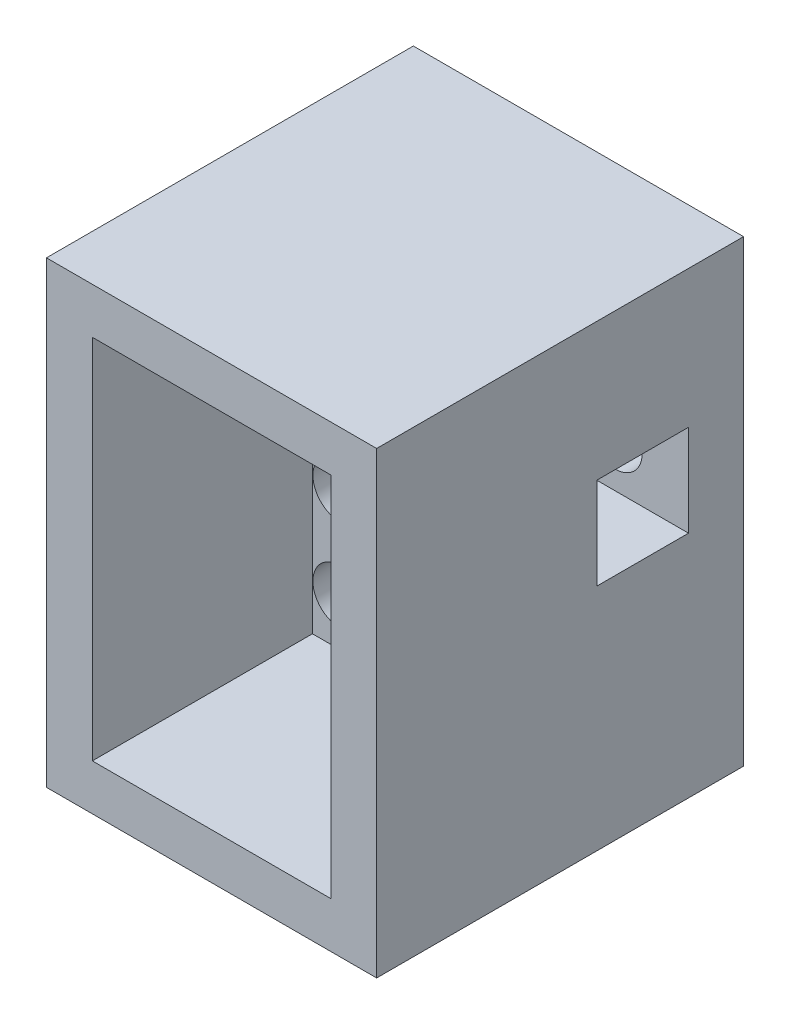
ISO-10303-21;
HEADER;
FILE_DESCRIPTION(('STEP AP214'),'2;1');
FILE_NAME('part.step','',(''),(''),'','','');
FILE_SCHEMA(('AUTOMOTIVE_DESIGN { 1 0 10303 214 1 1 1 1 }'));
ENDSEC;
DATA;
#1=APPLICATION_CONTEXT('core data for automotive mechanical design processes');
#2=APPLICATION_PROTOCOL_DEFINITION('international standard','automotive_design',2000,#1);
#3=PRODUCT_CONTEXT('',#1,'mechanical');
#4=PRODUCT('Part','Part','',(#3));
#5=PRODUCT_RELATED_PRODUCT_CATEGORY('part','',(#4));
#6=PRODUCT_DEFINITION_FORMATION('','',#4);
#7=PRODUCT_DEFINITION_CONTEXT('part definition',#1,'design');
#8=PRODUCT_DEFINITION('design','',#6,#7);
#9=PRODUCT_DEFINITION_SHAPE('','',#8);
#10=(LENGTH_UNIT() NAMED_UNIT(*) SI_UNIT(.MILLI.,.METRE.));
#11=(NAMED_UNIT(*) PLANE_ANGLE_UNIT() SI_UNIT($,.RADIAN.));
#12=(NAMED_UNIT(*) SI_UNIT($,.STERADIAN.) SOLID_ANGLE_UNIT());
#13=UNCERTAINTY_MEASURE_WITH_UNIT(LENGTH_MEASURE(1.E-05),#10,'distance_accuracy_value','');
#14=(GEOMETRIC_REPRESENTATION_CONTEXT(3) GLOBAL_UNCERTAINTY_ASSIGNED_CONTEXT((#13)) GLOBAL_UNIT_ASSIGNED_CONTEXT((#10,
#11,#12)) REPRESENTATION_CONTEXT('',''));
#15=CARTESIAN_POINT('',(0.,0.,0.));
#16=DIRECTION('',(0.,0.,1.));
#17=DIRECTION('',(1.,0.,0.));
#18=AXIS2_PLACEMENT_3D('',#15,#16,#17);
#19=CARTESIAN_POINT('',(0.,0.,8.));
#20=DIRECTION('',(0.,0.,1.));
#21=DIRECTION('',(1.,0.,0.));
#22=AXIS2_PLACEMENT_3D('',#19,#20,#21);
#23=PLANE('',#22);
#24=CARTESIAN_POINT('',(5.,7.5,8.));
#25=DIRECTION('',(0.,0.,1.));
#26=DIRECTION('',(1.,0.,0.));
#27=AXIS2_PLACEMENT_3D('',#24,#25,#26);
#28=CIRCLE('',#27,1.475);
#29=CARTESIAN_POINT('',(6.475,7.5,8.));
#30=VERTEX_POINT('',#29);
#31=EDGE_CURVE('E350',#30,#30,#28,.T.);
#32=ORIENTED_EDGE('',*,*,#31,.F.);
#33=EDGE_LOOP('',(#32));
#34=FACE_BOUND('',#33,.T.);
#35=DIRECTION('',(0.,1.,0.));
#36=VECTOR('',#35,1.);
#37=CARTESIAN_POINT('',(2.5,10.,8.));
#38=LINE('',#37,#36);
#39=CARTESIAN_POINT('',(2.5,7.00000000000001,8.));
#40=VERTEX_POINT('',#39);
#41=CARTESIAN_POINT('',(2.5,10.,8.));
#42=VERTEX_POINT('',#41);
#43=EDGE_CURVE('E217',#40,#42,#38,.T.);
#44=ORIENTED_EDGE('',*,*,#43,.F.);
#45=DIRECTION('',(-0.707106781186547,0.707106781186548,0.));
#46=VECTOR('',#45,1.);
#47=CARTESIAN_POINT('',(4.75,4.75,8.));
#48=LINE('',#47,#46);
#49=CARTESIAN_POINT('',(4.5,5.,8.));
#50=VERTEX_POINT('',#49);
#51=EDGE_CURVE('E55',#40,#50,#48,.F.);
#52=ORIENTED_EDGE('',*,*,#51,.T.);
#53=DIRECTION('',(1.,0.,0.));
#54=VECTOR('',#53,1.);
#55=CARTESIAN_POINT('',(-4.57106781186548,5.,8.));
#56=LINE('',#55,#54);
#57=CARTESIAN_POINT('',(6.5,5.,8.));
#58=VERTEX_POINT('',#57);
#59=EDGE_CURVE('E198',#50,#58,#56,.T.);
#60=ORIENTED_EDGE('',*,*,#59,.T.);
#61=DIRECTION('',(0.,1.,0.));
#62=VECTOR('',#61,1.);
#63=CARTESIAN_POINT('',(6.5,10.,8.));
#64=LINE('',#63,#62);
#65=CARTESIAN_POINT('',(6.5,10.,8.));
#66=VERTEX_POINT('',#65);
#67=EDGE_CURVE('E250',#58,#66,#64,.T.);
#68=ORIENTED_EDGE('',*,*,#67,.T.);
#69=DIRECTION('',(-1.,0.,0.));
#70=VECTOR('',#69,1.);
#71=CARTESIAN_POINT('',(-6.5,10.,8.));
#72=LINE('',#71,#70);
#73=EDGE_CURVE('E246',#66,#42,#72,.T.);
#74=ORIENTED_EDGE('',*,*,#73,.T.);
#75=EDGE_LOOP('',(#44,#52,#60,#68,#74));
#76=FACE_BOUND('',#75,.T.);
#77=ADVANCED_FACE('F43',(#34,#76),#23,.T.);
#78=CARTESIAN_POINT('',(2.5,10.,0.));
#79=DIRECTION('',(1.,0.,0.));
#80=DIRECTION('',(0.,1.,0.));
#81=AXIS2_PLACEMENT_3D('',#78,#79,#80);
#82=PLANE('',#81);
#83=DIRECTION('',(0.,-1.,0.));
#84=VECTOR('',#83,1.);
#85=CARTESIAN_POINT('',(2.5,0.,3.));
#86=LINE('',#85,#84);
#87=CARTESIAN_POINT('',(2.5,7.00000000000001,3.));
#88=VERTEX_POINT('',#87);
#89=CARTESIAN_POINT('',(2.5,0.,3.));
#90=VERTEX_POINT('',#89);
#91=EDGE_CURVE('E56',#88,#90,#86,.T.);
#92=ORIENTED_EDGE('',*,*,#91,.F.);
#93=DIRECTION('',(0.,0.,1.));
#94=VECTOR('',#93,1.);
#95=CARTESIAN_POINT('',(2.5,7.00000000000001,0.));
#96=LINE('',#95,#94);
#97=EDGE_CURVE('E61',#88,#40,#96,.T.);
#98=ORIENTED_EDGE('',*,*,#97,.T.);
#99=ORIENTED_EDGE('',*,*,#43,.T.);
#100=DIRECTION('',(0.,0.,1.));
#101=VECTOR('',#100,1.);
#102=CARTESIAN_POINT('',(2.5,10.,0.));
#103=LINE('',#102,#101);
#104=CARTESIAN_POINT('',(2.5,10.,0.));
#105=VERTEX_POINT('',#104);
#106=EDGE_CURVE('E240',#105,#42,#103,.T.);
#107=ORIENTED_EDGE('',*,*,#106,.F.);
#108=DIRECTION('',(0.,1.,0.));
#109=VECTOR('',#108,1.);
#110=CARTESIAN_POINT('',(2.5,10.,0.));
#111=LINE('',#110,#109);
#112=CARTESIAN_POINT('',(2.5,0.,0.));
#113=VERTEX_POINT('',#112);
#114=EDGE_CURVE('E222',#113,#105,#111,.T.);
#115=ORIENTED_EDGE('',*,*,#114,.F.);
#116=DIRECTION('',(0.,0.,1.));
#117=VECTOR('',#116,1.);
#118=CARTESIAN_POINT('',(2.5,0.,0.));
#119=LINE('',#118,#117);
#120=EDGE_CURVE('E238',#113,#90,#119,.T.);
#121=ORIENTED_EDGE('',*,*,#120,.T.);
#122=EDGE_LOOP('',(#92,#98,#99,#107,#115,#121));
#123=FACE_BOUND('',#122,.T.);
#124=ADVANCED_FACE('F361',(#123),#82,.F.);
#125=CARTESIAN_POINT('',(5.,7.5,10.));
#126=DIRECTION('',(0.,0.,-1.));
#127=DIRECTION('',(-1.,0.,0.));
#128=AXIS2_PLACEMENT_3D('',#125,#126,#127);
#129=CYLINDRICAL_SURFACE('',#128,1.475);
#130=ORIENTED_EDGE('',*,*,#31,.T.);
#131=EDGE_LOOP('',(#130));
#132=FACE_BOUND('',#131,.T.);
#133=CARTESIAN_POINT('',(5.,7.5,0.));
#134=DIRECTION('',(0.,0.,-1.));
#135=DIRECTION('',(-1.,0.,0.));
#136=AXIS2_PLACEMENT_3D('',#133,#134,#135);
#137=CIRCLE('',#136,1.475);
#138=CARTESIAN_POINT('',(3.525,7.5,0.));
#139=VERTEX_POINT('',#138);
#140=EDGE_CURVE('E348',#139,#139,#137,.T.);
#141=ORIENTED_EDGE('',*,*,#140,.T.);
#142=EDGE_LOOP('',(#141));
#143=FACE_BOUND('',#142,.T.);
#144=ADVANCED_FACE('F418',(#132,#143),#129,.F.);
#145=CARTESIAN_POINT('',(-5.,7.5,10.));
#146=DIRECTION('',(0.,0.,-1.));
#147=DIRECTION('',(-1.,0.,0.));
#148=AXIS2_PLACEMENT_3D('',#145,#146,#147);
#149=CYLINDRICAL_SURFACE('',#148,1.475);
#150=CARTESIAN_POINT('',(-5.,7.5,8.));
#151=DIRECTION('',(0.,0.,1.));
#152=DIRECTION('',(1.,0.,0.));
#153=AXIS2_PLACEMENT_3D('',#150,#151,#152);
#154=CIRCLE('',#153,1.475);
#155=CARTESIAN_POINT('',(-3.525,7.5,8.));
#156=VERTEX_POINT('',#155);
#157=EDGE_CURVE('E343',#156,#156,#154,.T.);
#158=ORIENTED_EDGE('',*,*,#157,.T.);
#159=EDGE_LOOP('',(#158));
#160=FACE_BOUND('',#159,.T.);
#161=CARTESIAN_POINT('',(-5.,7.5,0.));
#162=DIRECTION('',(0.,0.,-1.));
#163=DIRECTION('',(-1.,0.,0.));
#164=AXIS2_PLACEMENT_3D('',#161,#162,#163);
#165=CIRCLE('',#164,1.475);
#166=CARTESIAN_POINT('',(-6.475,7.5,0.));
#167=VERTEX_POINT('',#166);
#168=EDGE_CURVE('E342',#167,#167,#165,.T.);
#169=ORIENTED_EDGE('',*,*,#168,.T.);
#170=EDGE_LOOP('',(#169));
#171=FACE_BOUND('',#170,.T.);
#172=ADVANCED_FACE('F532',(#160,#171),#149,.F.);
#173=CARTESIAN_POINT('',(5.,2.5,10.));
#174=DIRECTION('',(0.,0.,-1.));
#175=DIRECTION('',(-1.,0.,0.));
#176=AXIS2_PLACEMENT_3D('',#173,#174,#175);
#177=CYLINDRICAL_SURFACE('',#176,1.475);
#178=CARTESIAN_POINT('',(5.,2.5,3.));
#179=DIRECTION('',(0.,0.,-1.));
#180=DIRECTION('',(-1.,0.,0.));
#181=AXIS2_PLACEMENT_3D('',#178,#179,#180);
#182=CIRCLE('',#181,1.475);
#183=CARTESIAN_POINT('',(3.525,2.5,3.));
#184=VERTEX_POINT('',#183);
#185=EDGE_CURVE('E199',#184,#184,#182,.F.);
#186=ORIENTED_EDGE('',*,*,#185,.T.);
#187=EDGE_LOOP('',(#186));
#188=FACE_BOUND('',#187,.T.);
#189=CARTESIAN_POINT('',(5.,2.5,0.));
#190=DIRECTION('',(0.,0.,-1.));
#191=DIRECTION('',(-1.,0.,0.));
#192=AXIS2_PLACEMENT_3D('',#189,#190,#191);
#193=CIRCLE('',#192,1.475);
#194=CARTESIAN_POINT('',(3.525,2.5,0.));
#195=VERTEX_POINT('',#194);
#196=EDGE_CURVE('E336',#195,#195,#193,.T.);
#197=ORIENTED_EDGE('',*,*,#196,.T.);
#198=EDGE_LOOP('',(#197));
#199=FACE_BOUND('',#198,.T.);
#200=ADVANCED_FACE('F524',(#188,#199),#177,.F.);
#201=CARTESIAN_POINT('',(-5.,2.5,10.));
#202=DIRECTION('',(0.,0.,-1.));
#203=DIRECTION('',(-1.,0.,0.));
#204=AXIS2_PLACEMENT_3D('',#201,#202,#203);
#205=CYLINDRICAL_SURFACE('',#204,1.475);
#206=CARTESIAN_POINT('',(-5.,2.5,8.));
#207=DIRECTION('',(0.,0.,1.));
#208=DIRECTION('',(1.,0.,0.));
#209=AXIS2_PLACEMENT_3D('',#206,#207,#208);
#210=CIRCLE('',#209,1.475);
#211=CARTESIAN_POINT('',(-3.525,2.5,8.));
#212=VERTEX_POINT('',#211);
#213=EDGE_CURVE('E335',#212,#212,#210,.T.);
#214=ORIENTED_EDGE('',*,*,#213,.T.);
#215=EDGE_LOOP('',(#214));
#216=FACE_BOUND('',#215,.T.);
#217=CARTESIAN_POINT('',(-5.,2.5,0.));
#218=DIRECTION('',(0.,0.,-1.));
#219=DIRECTION('',(-1.,0.,0.));
#220=AXIS2_PLACEMENT_3D('',#217,#218,#219);
#221=CIRCLE('',#220,1.475);
#222=CARTESIAN_POINT('',(-6.475,2.5,0.));
#223=VERTEX_POINT('',#222);
#224=EDGE_CURVE('E333',#223,#223,#221,.T.);
#225=ORIENTED_EDGE('',*,*,#224,.T.);
#226=EDGE_LOOP('',(#225));
#227=FACE_BOUND('',#226,.T.);
#228=ADVANCED_FACE('F513',(#216,#227),#205,.F.);
#229=CARTESIAN_POINT('',(5.,-2.5,10.));
#230=DIRECTION('',(0.,0.,-1.));
#231=DIRECTION('',(-1.,0.,0.));
#232=AXIS2_PLACEMENT_3D('',#229,#230,#231);
#233=CYLINDRICAL_SURFACE('',#232,1.475);
#234=CARTESIAN_POINT('',(5.,-2.5,8.));
#235=DIRECTION('',(0.,0.,1.));
#236=DIRECTION('',(1.,0.,0.));
#237=AXIS2_PLACEMENT_3D('',#234,#235,#236);
#238=CIRCLE('',#237,1.475);
#239=CARTESIAN_POINT('',(6.475,-2.5,8.));
#240=VERTEX_POINT('',#239);
#241=EDGE_CURVE('E326',#240,#240,#238,.T.);
#242=ORIENTED_EDGE('',*,*,#241,.T.);
#243=EDGE_LOOP('',(#242));
#244=FACE_BOUND('',#243,.T.);
#245=CARTESIAN_POINT('',(5.,-2.5,0.));
#246=DIRECTION('',(0.,0.,-1.));
#247=DIRECTION('',(-1.,0.,0.));
#248=AXIS2_PLACEMENT_3D('',#245,#246,#247);
#249=CIRCLE('',#248,1.475);
#250=CARTESIAN_POINT('',(3.525,-2.5,0.));
#251=VERTEX_POINT('',#250);
#252=EDGE_CURVE('E328',#251,#251,#249,.T.);
#253=ORIENTED_EDGE('',*,*,#252,.T.);
#254=EDGE_LOOP('',(#253));
#255=FACE_BOUND('',#254,.T.);
#256=ADVANCED_FACE('F504',(#244,#255),#233,.F.);
#257=CARTESIAN_POINT('',(-5.,-2.5,10.));
#258=DIRECTION('',(0.,0.,-1.));
#259=DIRECTION('',(-1.,0.,0.));
#260=AXIS2_PLACEMENT_3D('',#257,#258,#259);
#261=CYLINDRICAL_SURFACE('',#260,1.475);
#262=CARTESIAN_POINT('',(-5.,-2.5,8.));
#263=DIRECTION('',(0.,0.,1.));
#264=DIRECTION('',(1.,0.,0.));
#265=AXIS2_PLACEMENT_3D('',#262,#263,#264);
#266=CIRCLE('',#265,1.475);
#267=CARTESIAN_POINT('',(-3.525,-2.5,8.));
#268=VERTEX_POINT('',#267);
#269=EDGE_CURVE('E319',#268,#268,#266,.T.);
#270=ORIENTED_EDGE('',*,*,#269,.T.);
#271=EDGE_LOOP('',(#270));
#272=FACE_BOUND('',#271,.T.);
#273=CARTESIAN_POINT('',(-5.,-2.5,0.));
#274=DIRECTION('',(0.,0.,-1.));
#275=DIRECTION('',(-1.,0.,0.));
#276=AXIS2_PLACEMENT_3D('',#273,#274,#275);
#277=CIRCLE('',#276,1.475);
#278=CARTESIAN_POINT('',(-6.475,-2.5,0.));
#279=VERTEX_POINT('',#278);
#280=EDGE_CURVE('E323',#279,#279,#277,.T.);
#281=ORIENTED_EDGE('',*,*,#280,.T.);
#282=EDGE_LOOP('',(#281));
#283=FACE_BOUND('',#282,.T.);
#284=ADVANCED_FACE('F494',(#272,#283),#261,.F.);
#285=CARTESIAN_POINT('',(5.,-7.5,10.));
#286=DIRECTION('',(0.,0.,-1.));
#287=DIRECTION('',(-1.,0.,0.));
#288=AXIS2_PLACEMENT_3D('',#285,#286,#287);
#289=CYLINDRICAL_SURFACE('',#288,1.475);
#290=CARTESIAN_POINT('',(5.,-7.5,8.));
#291=DIRECTION('',(0.,0.,1.));
#292=DIRECTION('',(1.,0.,0.));
#293=AXIS2_PLACEMENT_3D('',#290,#291,#292);
#294=CIRCLE('',#293,1.475);
#295=CARTESIAN_POINT('',(6.475,-7.5,8.));
#296=VERTEX_POINT('',#295);
#297=EDGE_CURVE('E314',#296,#296,#294,.T.);
#298=ORIENTED_EDGE('',*,*,#297,.T.);
#299=EDGE_LOOP('',(#298));
#300=FACE_BOUND('',#299,.T.);
#301=CARTESIAN_POINT('',(5.,-7.5,0.));
#302=DIRECTION('',(0.,0.,-1.));
#303=DIRECTION('',(-1.,0.,0.));
#304=AXIS2_PLACEMENT_3D('',#301,#302,#303);
#305=CIRCLE('',#304,1.475);
#306=CARTESIAN_POINT('',(3.525,-7.5,0.));
#307=VERTEX_POINT('',#306);
#308=EDGE_CURVE('E320',#307,#307,#305,.T.);
#309=ORIENTED_EDGE('',*,*,#308,.T.);
#310=EDGE_LOOP('',(#309));
#311=FACE_BOUND('',#310,.T.);
#312=ADVANCED_FACE('F484',(#300,#311),#289,.F.);
#313=CARTESIAN_POINT('',(0.,-7.5,10.));
#314=DIRECTION('',(0.,0.,-1.));
#315=DIRECTION('',(-1.,0.,0.));
#316=AXIS2_PLACEMENT_3D('',#313,#314,#315);
#317=CYLINDRICAL_SURFACE('',#316,1.475);
#318=CARTESIAN_POINT('',(0.,-7.5,8.));
#319=DIRECTION('',(0.,0.,1.));
#320=DIRECTION('',(1.,0.,0.));
#321=AXIS2_PLACEMENT_3D('',#318,#319,#320);
#322=CIRCLE('',#321,1.475);
#323=CARTESIAN_POINT('',(1.475,-7.5,8.));
#324=VERTEX_POINT('',#323);
#325=EDGE_CURVE('E308',#324,#324,#322,.T.);
#326=ORIENTED_EDGE('',*,*,#325,.T.);
#327=EDGE_LOOP('',(#326));
#328=FACE_BOUND('',#327,.T.);
#329=CARTESIAN_POINT('',(0.,-7.5,0.));
#330=DIRECTION('',(0.,0.,-1.));
#331=DIRECTION('',(-1.,0.,0.));
#332=AXIS2_PLACEMENT_3D('',#329,#330,#331);
#333=CIRCLE('',#332,1.475);
#334=CARTESIAN_POINT('',(-1.475,-7.5,0.));
#335=VERTEX_POINT('',#334);
#336=EDGE_CURVE('E313',#335,#335,#333,.T.);
#337=ORIENTED_EDGE('',*,*,#336,.T.);
#338=EDGE_LOOP('',(#337));
#339=FACE_BOUND('',#338,.T.);
#340=ADVANCED_FACE('F479',(#328,#339),#317,.F.);
#341=CARTESIAN_POINT('',(-9.,12.5,20.));
#342=DIRECTION('',(0.,-1.,0.));
#343=DIRECTION('',(0.,0.,-1.));
#344=AXIS2_PLACEMENT_3D('',#341,#342,#343);
#345=PLANE('',#344);
#346=DIRECTION('',(-1.,0.,0.));
#347=VECTOR('',#346,1.);
#348=CARTESIAN_POINT('',(-9.,12.5,0.));
#349=LINE('',#348,#347);
#350=CARTESIAN_POINT('',(9.,12.5,0.));
#351=VERTEX_POINT('',#350);
#352=CARTESIAN_POINT('',(-9.,12.5,0.));
#353=VERTEX_POINT('',#352);
#354=EDGE_CURVE('E269',#351,#353,#349,.T.);
#355=ORIENTED_EDGE('',*,*,#354,.T.);
#356=DIRECTION('',(0.,0.,-1.));
#357=VECTOR('',#356,1.);
#358=CARTESIAN_POINT('',(-9.,12.5,20.));
#359=LINE('',#358,#357);
#360=CARTESIAN_POINT('',(-9.,12.5,20.));
#361=VERTEX_POINT('',#360);
#362=EDGE_CURVE('E301',#361,#353,#359,.T.);
#363=ORIENTED_EDGE('',*,*,#362,.F.);
#364=DIRECTION('',(-1.,0.,0.));
#365=VECTOR('',#364,1.);
#366=CARTESIAN_POINT('',(-9.,12.5,20.));
#367=LINE('',#366,#365);
#368=CARTESIAN_POINT('',(9.,12.5,20.));
#369=VERTEX_POINT('',#368);
#370=EDGE_CURVE('E280',#369,#361,#367,.T.);
#371=ORIENTED_EDGE('',*,*,#370,.F.);
#372=DIRECTION('',(0.,0.,-1.));
#373=VECTOR('',#372,1.);
#374=CARTESIAN_POINT('',(9.,12.5,20.));
#375=LINE('',#374,#373);
#376=EDGE_CURVE('E290',#369,#351,#375,.T.);
#377=ORIENTED_EDGE('',*,*,#376,.T.);
#378=EDGE_LOOP('',(#355,#363,#371,#377));
#379=FACE_BOUND('',#378,.T.);
#380=ADVANCED_FACE('F482',(#379),#345,.F.);
#381=CARTESIAN_POINT('',(-9.,-12.5,20.));
#382=DIRECTION('',(1.,0.,0.));
#383=DIRECTION('',(0.,0.,-1.));
#384=AXIS2_PLACEMENT_3D('',#381,#382,#383);
#385=PLANE('',#384);
#386=DIRECTION('',(0.,-1.,0.));
#387=VECTOR('',#386,1.);
#388=CARTESIAN_POINT('',(-9.,-12.5,0.));
#389=LINE('',#388,#387);
#390=CARTESIAN_POINT('',(-9.,-12.5,0.));
#391=VERTEX_POINT('',#390);
#392=EDGE_CURVE('E289',#353,#391,#389,.T.);
#393=ORIENTED_EDGE('',*,*,#392,.T.);
#394=DIRECTION('',(0.,0.,-1.));
#395=VECTOR('',#394,1.);
#396=CARTESIAN_POINT('',(-9.,-12.5,20.));
#397=LINE('',#396,#395);
#398=CARTESIAN_POINT('',(-9.,-12.5,20.));
#399=VERTEX_POINT('',#398);
#400=EDGE_CURVE('E299',#399,#391,#397,.T.);
#401=ORIENTED_EDGE('',*,*,#400,.F.);
#402=DIRECTION('',(0.,-1.,0.));
#403=VECTOR('',#402,1.);
#404=CARTESIAN_POINT('',(-9.,-12.5,20.));
#405=LINE('',#404,#403);
#406=EDGE_CURVE('E278',#361,#399,#405,.T.);
#407=ORIENTED_EDGE('',*,*,#406,.F.);
#408=ORIENTED_EDGE('',*,*,#362,.T.);
#409=EDGE_LOOP('',(#393,#401,#407,#408));
#410=FACE_BOUND('',#409,.T.);
#411=ADVANCED_FACE('F614',(#410),#385,.F.);
#412=CARTESIAN_POINT('',(-9.,-12.5,20.));
#413=DIRECTION('',(0.,1.,0.));
#414=DIRECTION('',(-1.,0.,0.));
#415=AXIS2_PLACEMENT_3D('',#412,#413,#414);
#416=PLANE('',#415);
#417=DIRECTION('',(1.,0.,0.));
#418=VECTOR('',#417,1.);
#419=CARTESIAN_POINT('',(-9.,-12.5,0.));
#420=LINE('',#419,#418);
#421=CARTESIAN_POINT('',(9.,-12.5,0.));
#422=VERTEX_POINT('',#421);
#423=EDGE_CURVE('E295',#391,#422,#420,.T.);
#424=ORIENTED_EDGE('',*,*,#423,.T.);
#425=DIRECTION('',(0.,0.,-1.));
#426=VECTOR('',#425,1.);
#427=CARTESIAN_POINT('',(9.,-12.5,20.));
#428=LINE('',#427,#426);
#429=CARTESIAN_POINT('',(9.,-12.5,20.));
#430=VERTEX_POINT('',#429);
#431=EDGE_CURVE('E300',#430,#422,#428,.T.);
#432=ORIENTED_EDGE('',*,*,#431,.F.);
#433=DIRECTION('',(1.,0.,0.));
#434=VECTOR('',#433,1.);
#435=CARTESIAN_POINT('',(-9.,-12.5,20.));
#436=LINE('',#435,#434);
#437=EDGE_CURVE('E281',#399,#430,#436,.T.);
#438=ORIENTED_EDGE('',*,*,#437,.F.);
#439=ORIENTED_EDGE('',*,*,#400,.T.);
#440=EDGE_LOOP('',(#424,#432,#438,#439));
#441=FACE_BOUND('',#440,.T.);
#442=ADVANCED_FACE('F610',(#441),#416,.F.);
#443=CARTESIAN_POINT('',(9.,-12.5,20.));
#444=DIRECTION('',(-1.,0.,0.));
#445=DIRECTION('',(0.,0.,1.));
#446=AXIS2_PLACEMENT_3D('',#443,#444,#445);
#447=PLANE('',#446);
#448=DIRECTION('',(0.,1.,0.));
#449=VECTOR('',#448,1.);
#450=CARTESIAN_POINT('',(9.,0.,3.));
#451=LINE('',#450,#449);
#452=CARTESIAN_POINT('',(9.,0.,3.));
#453=VERTEX_POINT('',#452);
#454=CARTESIAN_POINT('',(9.,5.,3.));
#455=VERTEX_POINT('',#454);
#456=EDGE_CURVE('E176',#453,#455,#451,.T.);
#457=ORIENTED_EDGE('',*,*,#456,.F.);
#458=DIRECTION('',(0.,0.,-1.));
#459=VECTOR('',#458,1.);
#460=CARTESIAN_POINT('',(9.,0.,3.));
#461=LINE('',#460,#459);
#462=CARTESIAN_POINT('',(9.,0.,8.));
#463=VERTEX_POINT('',#462);
#464=EDGE_CURVE('E184',#463,#453,#461,.T.);
#465=ORIENTED_EDGE('',*,*,#464,.F.);
#466=DIRECTION('',(0.,-1.,0.));
#467=VECTOR('',#466,1.);
#468=CARTESIAN_POINT('',(9.,0.,8.));
#469=LINE('',#468,#467);
#470=CARTESIAN_POINT('',(9.,5.,8.));
#471=VERTEX_POINT('',#470);
#472=EDGE_CURVE('E187',#471,#463,#469,.T.);
#473=ORIENTED_EDGE('',*,*,#472,.F.);
#474=DIRECTION('',(0.,0.,1.));
#475=VECTOR('',#474,1.);
#476=CARTESIAN_POINT('',(9.,5.,3.));
#477=LINE('',#476,#475);
#478=EDGE_CURVE('E169',#455,#471,#477,.T.);
#479=ORIENTED_EDGE('',*,*,#478,.F.);
#480=EDGE_LOOP('',(#457,#465,#473,#479));
#481=FACE_BOUND('',#480,.T.);
#482=DIRECTION('',(0.,1.,0.));
#483=VECTOR('',#482,1.);
#484=CARTESIAN_POINT('',(9.,-12.5,0.));
#485=LINE('',#484,#483);
#486=EDGE_CURVE('E283',#422,#351,#485,.T.);
#487=ORIENTED_EDGE('',*,*,#486,.T.);
#488=ORIENTED_EDGE('',*,*,#376,.F.);
#489=DIRECTION('',(0.,1.,0.));
#490=VECTOR('',#489,1.);
#491=CARTESIAN_POINT('',(9.,-12.5,20.));
#492=LINE('',#491,#490);
#493=EDGE_CURVE('E284',#430,#369,#492,.T.);
#494=ORIENTED_EDGE('',*,*,#493,.F.);
#495=ORIENTED_EDGE('',*,*,#431,.T.);
#496=EDGE_LOOP('',(#487,#488,#494,#495));
#497=FACE_BOUND('',#496,.T.);
#498=ADVANCED_FACE('F188',(#481,#497),#447,.F.);
#499=CARTESIAN_POINT('',(0.,0.,20.));
#500=DIRECTION('',(0.,0.,1.));
#501=DIRECTION('',(1.,0.,0.));
#502=AXIS2_PLACEMENT_3D('',#499,#500,#501);
#503=PLANE('',#502);
#504=DIRECTION('',(0.,1.,0.));
#505=VECTOR('',#504,1.);
#506=CARTESIAN_POINT('',(6.5,10.,20.));
#507=LINE('',#506,#505);
#508=CARTESIAN_POINT('',(6.5,-10.,20.));
#509=VERTEX_POINT('',#508);
#510=CARTESIAN_POINT('',(6.5,10.,20.));
#511=VERTEX_POINT('',#510);
#512=EDGE_CURVE('E237',#509,#511,#507,.T.);
#513=ORIENTED_EDGE('',*,*,#512,.F.);
#514=DIRECTION('',(1.,0.,0.));
#515=VECTOR('',#514,1.);
#516=CARTESIAN_POINT('',(-6.5,-10.,20.));
#517=LINE('',#516,#515);
#518=CARTESIAN_POINT('',(-6.5,-10.,20.));
#519=VERTEX_POINT('',#518);
#520=EDGE_CURVE('E264',#519,#509,#517,.T.);
#521=ORIENTED_EDGE('',*,*,#520,.F.);
#522=DIRECTION('',(0.,-1.,0.));
#523=VECTOR('',#522,1.);
#524=CARTESIAN_POINT('',(-6.5,10.,20.));
#525=LINE('',#524,#523);
#526=CARTESIAN_POINT('',(-6.5,10.,20.));
#527=VERTEX_POINT('',#526);
#528=EDGE_CURVE('E265',#527,#519,#525,.T.);
#529=ORIENTED_EDGE('',*,*,#528,.F.);
#530=DIRECTION('',(-1.,0.,0.));
#531=VECTOR('',#530,1.);
#532=CARTESIAN_POINT('',(-6.5,10.,20.));
#533=LINE('',#532,#531);
#534=EDGE_CURVE('E259',#511,#527,#533,.T.);
#535=ORIENTED_EDGE('',*,*,#534,.F.);
#536=EDGE_LOOP('',(#513,#521,#529,#535));
#537=FACE_BOUND('',#536,.T.);
#538=ORIENTED_EDGE('',*,*,#370,.T.);
#539=ORIENTED_EDGE('',*,*,#406,.T.);
#540=ORIENTED_EDGE('',*,*,#437,.T.);
#541=ORIENTED_EDGE('',*,*,#493,.T.);
#542=EDGE_LOOP('',(#538,#539,#540,#541));
#543=FACE_BOUND('',#542,.T.);
#544=ADVANCED_FACE('F396',(#537,#543),#503,.T.);
#545=CARTESIAN_POINT('',(0.,0.,0.));
#546=DIRECTION('',(0.,0.,1.));
#547=DIRECTION('',(1.,0.,0.));
#548=AXIS2_PLACEMENT_3D('',#545,#546,#547);
#549=PLANE('',#548);
#550=CARTESIAN_POINT('',(0.,-2.5,0.));
#551=DIRECTION('',(0.,0.,-1.));
#552=DIRECTION('',(-1.,0.,0.));
#553=AXIS2_PLACEMENT_3D('',#550,#551,#552);
#554=CIRCLE('',#553,1.475);
#555=CARTESIAN_POINT('',(-1.475,-2.5,0.));
#556=VERTEX_POINT('',#555);
#557=EDGE_CURVE('E210',#556,#556,#554,.T.);
#558=ORIENTED_EDGE('',*,*,#557,.F.);
#559=EDGE_LOOP('',(#558));
#560=FACE_BOUND('',#559,.T.);
#561=CARTESIAN_POINT('',(-5.,-7.5,0.));
#562=DIRECTION('',(0.,0.,-1.));
#563=DIRECTION('',(-1.,0.,0.));
#564=AXIS2_PLACEMENT_3D('',#561,#562,#563);
#565=CIRCLE('',#564,1.475);
#566=CARTESIAN_POINT('',(-6.475,-7.5,0.));
#567=VERTEX_POINT('',#566);
#568=EDGE_CURVE('E209',#567,#567,#565,.T.);
#569=ORIENTED_EDGE('',*,*,#568,.F.);
#570=EDGE_LOOP('',(#569));
#571=FACE_BOUND('',#570,.T.);
#572=DIRECTION('',(-1.,0.,0.));
#573=VECTOR('',#572,1.);
#574=CARTESIAN_POINT('',(-2.5,10.,0.));
#575=LINE('',#574,#573);
#576=CARTESIAN_POINT('',(-2.5,10.,0.));
#577=VERTEX_POINT('',#576);
#578=EDGE_CURVE('E221',#105,#577,#575,.T.);
#579=ORIENTED_EDGE('',*,*,#578,.T.);
#580=DIRECTION('',(0.,-1.,0.));
#581=VECTOR('',#580,1.);
#582=CARTESIAN_POINT('',(-2.5,10.,0.));
#583=LINE('',#582,#581);
#584=CARTESIAN_POINT('',(-2.5,0.,0.));
#585=VERTEX_POINT('',#584);
#586=EDGE_CURVE('E212',#577,#585,#583,.T.);
#587=ORIENTED_EDGE('',*,*,#586,.T.);
#588=DIRECTION('',(1.,0.,0.));
#589=VECTOR('',#588,1.);
#590=CARTESIAN_POINT('',(-2.5,0.,0.));
#591=LINE('',#590,#589);
#592=EDGE_CURVE('E220',#585,#113,#591,.T.);
#593=ORIENTED_EDGE('',*,*,#592,.T.);
#594=ORIENTED_EDGE('',*,*,#114,.T.);
#595=EDGE_LOOP('',(#579,#587,#593,#594));
#596=FACE_BOUND('',#595,.T.);
#597=ORIENTED_EDGE('',*,*,#354,.F.);
#598=ORIENTED_EDGE('',*,*,#486,.F.);
#599=ORIENTED_EDGE('',*,*,#423,.F.);
#600=ORIENTED_EDGE('',*,*,#392,.F.);
#601=EDGE_LOOP('',(#597,#598,#599,#600));
#602=FACE_BOUND('',#601,.T.);
#603=ORIENTED_EDGE('',*,*,#336,.F.);
#604=EDGE_LOOP('',(#603));
#605=FACE_BOUND('',#604,.T.);
#606=ORIENTED_EDGE('',*,*,#308,.F.);
#607=EDGE_LOOP('',(#606));
#608=FACE_BOUND('',#607,.T.);
#609=ORIENTED_EDGE('',*,*,#280,.F.);
#610=EDGE_LOOP('',(#609));
#611=FACE_BOUND('',#610,.T.);
#612=ORIENTED_EDGE('',*,*,#252,.F.);
#613=EDGE_LOOP('',(#612));
#614=FACE_BOUND('',#613,.T.);
#615=ORIENTED_EDGE('',*,*,#224,.F.);
#616=EDGE_LOOP('',(#615));
#617=FACE_BOUND('',#616,.T.);
#618=ORIENTED_EDGE('',*,*,#196,.F.);
#619=EDGE_LOOP('',(#618));
#620=FACE_BOUND('',#619,.T.);
#621=ORIENTED_EDGE('',*,*,#168,.F.);
#622=EDGE_LOOP('',(#621));
#623=FACE_BOUND('',#622,.T.);
#624=ORIENTED_EDGE('',*,*,#140,.F.);
#625=EDGE_LOOP('',(#624));
#626=FACE_BOUND('',#625,.T.);
#627=ADVANCED_FACE('F368',(#560,#571,#596,#602,#605,#608,#611,#614,#617,#620,#623,#626),#549,.F.);
#628=CARTESIAN_POINT('',(6.5,10.,8.));
#629=DIRECTION('',(1.,0.,0.));
#630=DIRECTION('',(0.,1.,0.));
#631=AXIS2_PLACEMENT_3D('',#628,#629,#630);
#632=PLANE('',#631);
#633=ORIENTED_EDGE('',*,*,#512,.T.);
#634=DIRECTION('',(0.,0.,1.));
#635=VECTOR('',#634,1.);
#636=CARTESIAN_POINT('',(6.5,10.,8.));
#637=LINE('',#636,#635);
#638=EDGE_CURVE('E260',#66,#511,#637,.T.);
#639=ORIENTED_EDGE('',*,*,#638,.F.);
#640=ORIENTED_EDGE('',*,*,#67,.F.);
#641=CARTESIAN_POINT('',(6.5,0.,8.));
#642=VERTEX_POINT('',#641);
#643=EDGE_CURVE('E201',#642,#58,#64,.T.);
#644=ORIENTED_EDGE('',*,*,#643,.F.);
#645=CARTESIAN_POINT('',(6.5,-10.,8.));
#646=VERTEX_POINT('',#645);
#647=EDGE_CURVE('E241',#646,#642,#64,.T.);
#648=ORIENTED_EDGE('',*,*,#647,.F.);
#649=DIRECTION('',(0.,0.,1.));
#650=VECTOR('',#649,1.);
#651=CARTESIAN_POINT('',(6.5,-10.,8.));
#652=LINE('',#651,#650);
#653=EDGE_CURVE('E268',#646,#509,#652,.T.);
#654=ORIENTED_EDGE('',*,*,#653,.T.);
#655=EDGE_LOOP('',(#633,#639,#640,#644,#648,#654));
#656=FACE_BOUND('',#655,.T.);
#657=ADVANCED_FACE('F385',(#656),#632,.F.);
#658=CARTESIAN_POINT('',(-6.5,-10.,8.));
#659=DIRECTION('',(0.,-1.,0.));
#660=DIRECTION('',(0.,0.,-1.));
#661=AXIS2_PLACEMENT_3D('',#658,#659,#660);
#662=PLANE('',#661);
#663=ORIENTED_EDGE('',*,*,#520,.T.);
#664=ORIENTED_EDGE('',*,*,#653,.F.);
#665=DIRECTION('',(1.,0.,0.));
#666=VECTOR('',#665,1.);
#667=CARTESIAN_POINT('',(-6.5,-10.,8.));
#668=LINE('',#667,#666);
#669=CARTESIAN_POINT('',(-6.5,-10.,8.));
#670=VERTEX_POINT('',#669);
#671=EDGE_CURVE('E255',#670,#646,#668,.T.);
#672=ORIENTED_EDGE('',*,*,#671,.F.);
#673=DIRECTION('',(0.,0.,1.));
#674=VECTOR('',#673,1.);
#675=CARTESIAN_POINT('',(-6.5,-10.,8.));
#676=LINE('',#675,#674);
#677=EDGE_CURVE('E271',#670,#519,#676,.T.);
#678=ORIENTED_EDGE('',*,*,#677,.T.);
#679=EDGE_LOOP('',(#663,#664,#672,#678));
#680=FACE_BOUND('',#679,.T.);
#681=ADVANCED_FACE('F392',(#680),#662,.F.);
#682=CARTESIAN_POINT('',(-6.5,10.,8.));
#683=DIRECTION('',(-1.,0.,0.));
#684=DIRECTION('',(0.,0.,1.));
#685=AXIS2_PLACEMENT_3D('',#682,#683,#684);
#686=PLANE('',#685);
#687=ORIENTED_EDGE('',*,*,#528,.T.);
#688=ORIENTED_EDGE('',*,*,#677,.F.);
#689=DIRECTION('',(0.,-1.,0.));
#690=VECTOR('',#689,1.);
#691=CARTESIAN_POINT('',(-6.5,10.,8.));
#692=LINE('',#691,#690);
#693=CARTESIAN_POINT('',(-6.5,10.,8.));
#694=VERTEX_POINT('',#693);
#695=EDGE_CURVE('E253',#694,#670,#692,.T.);
#696=ORIENTED_EDGE('',*,*,#695,.F.);
#697=DIRECTION('',(0.,0.,1.));
#698=VECTOR('',#697,1.);
#699=CARTESIAN_POINT('',(-6.5,10.,8.));
#700=LINE('',#699,#698);
#701=EDGE_CURVE('E272',#694,#527,#700,.T.);
#702=ORIENTED_EDGE('',*,*,#701,.T.);
#703=EDGE_LOOP('',(#687,#688,#696,#702));
#704=FACE_BOUND('',#703,.T.);
#705=ADVANCED_FACE('F399',(#704),#686,.F.);
#706=CARTESIAN_POINT('',(-6.5,10.,8.));
#707=DIRECTION('',(0.,1.,0.));
#708=DIRECTION('',(0.,0.,1.));
#709=AXIS2_PLACEMENT_3D('',#706,#707,#708);
#710=PLANE('',#709);
#711=ORIENTED_EDGE('',*,*,#534,.T.);
#712=ORIENTED_EDGE('',*,*,#701,.F.);
#713=CARTESIAN_POINT('',(-2.5,10.,8.));
#714=VERTEX_POINT('',#713);
#715=EDGE_CURVE('E248',#714,#694,#72,.T.);
#716=ORIENTED_EDGE('',*,*,#715,.F.);
#717=DIRECTION('',(0.,0.,1.));
#718=VECTOR('',#717,1.);
#719=CARTESIAN_POINT('',(-2.5,10.,0.));
#720=LINE('',#719,#718);
#721=EDGE_CURVE('E232',#577,#714,#720,.T.);
#722=ORIENTED_EDGE('',*,*,#721,.F.);
#723=ORIENTED_EDGE('',*,*,#578,.F.);
#724=ORIENTED_EDGE('',*,*,#106,.T.);
#725=ORIENTED_EDGE('',*,*,#73,.F.);
#726=ORIENTED_EDGE('',*,*,#638,.T.);
#727=EDGE_LOOP('',(#711,#712,#716,#722,#723,#724,#725,#726));
#728=FACE_BOUND('',#727,.T.);
#729=ADVANCED_FACE('F386',(#728),#710,.F.);
#730=ORIENTED_EDGE('',*,*,#647,.T.);
#731=DIRECTION('',(1.,0.,0.));
#732=VECTOR('',#731,1.);
#733=CARTESIAN_POINT('',(-2.5,0.,8.));
#734=LINE('',#733,#732);
#735=CARTESIAN_POINT('',(-2.5,0.,8.));
#736=VERTEX_POINT('',#735);
#737=EDGE_CURVE('E233',#736,#642,#734,.T.);
#738=ORIENTED_EDGE('',*,*,#737,.F.);
#739=DIRECTION('',(0.,-1.,0.));
#740=VECTOR('',#739,1.);
#741=CARTESIAN_POINT('',(-2.5,10.,8.));
#742=LINE('',#741,#740);
#743=EDGE_CURVE('E226',#714,#736,#742,.T.);
#744=ORIENTED_EDGE('',*,*,#743,.F.);
#745=ORIENTED_EDGE('',*,*,#715,.T.);
#746=ORIENTED_EDGE('',*,*,#695,.T.);
#747=ORIENTED_EDGE('',*,*,#671,.T.);
#748=EDGE_LOOP('',(#730,#738,#744,#745,#746,#747));
#749=FACE_BOUND('',#748,.T.);
#750=CARTESIAN_POINT('',(0.,-2.5,8.));
#751=DIRECTION('',(0.,0.,1.));
#752=DIRECTION('',(1.,0.,0.));
#753=AXIS2_PLACEMENT_3D('',#750,#751,#752);
#754=CIRCLE('',#753,1.475);
#755=CARTESIAN_POINT('',(1.475,-2.5,8.));
#756=VERTEX_POINT('',#755);
#757=EDGE_CURVE('E204',#756,#756,#754,.T.);
#758=ORIENTED_EDGE('',*,*,#757,.F.);
#759=EDGE_LOOP('',(#758));
#760=FACE_BOUND('',#759,.T.);
#761=CARTESIAN_POINT('',(-5.,-7.5,8.));
#762=DIRECTION('',(0.,0.,1.));
#763=DIRECTION('',(1.,0.,0.));
#764=AXIS2_PLACEMENT_3D('',#761,#762,#763);
#765=CIRCLE('',#764,1.475);
#766=CARTESIAN_POINT('',(-3.525,-7.5,8.));
#767=VERTEX_POINT('',#766);
#768=EDGE_CURVE('E213',#767,#767,#765,.T.);
#769=ORIENTED_EDGE('',*,*,#768,.F.);
#770=EDGE_LOOP('',(#769));
#771=FACE_BOUND('',#770,.T.);
#772=ORIENTED_EDGE('',*,*,#325,.F.);
#773=EDGE_LOOP('',(#772));
#774=FACE_BOUND('',#773,.T.);
#775=ORIENTED_EDGE('',*,*,#297,.F.);
#776=EDGE_LOOP('',(#775));
#777=FACE_BOUND('',#776,.T.);
#778=ORIENTED_EDGE('',*,*,#269,.F.);
#779=EDGE_LOOP('',(#778));
#780=FACE_BOUND('',#779,.T.);
#781=ORIENTED_EDGE('',*,*,#241,.F.);
#782=EDGE_LOOP('',(#781));
#783=FACE_BOUND('',#782,.T.);
#784=ORIENTED_EDGE('',*,*,#213,.F.);
#785=EDGE_LOOP('',(#784));
#786=FACE_BOUND('',#785,.T.);
#787=ORIENTED_EDGE('',*,*,#157,.F.);
#788=EDGE_LOOP('',(#787));
#789=FACE_BOUND('',#788,.T.);
#790=ADVANCED_FACE('F376',(#749,#760,#771,#774,#777,#780,#783,#786,#789),#23,.T.);
#791=CARTESIAN_POINT('',(-2.5,10.,0.));
#792=DIRECTION('',(-1.,0.,0.));
#793=DIRECTION('',(0.,-1.,0.));
#794=AXIS2_PLACEMENT_3D('',#791,#792,#793);
#795=PLANE('',#794);
#796=ORIENTED_EDGE('',*,*,#743,.T.);
#797=DIRECTION('',(0.,0.,1.));
#798=VECTOR('',#797,1.);
#799=CARTESIAN_POINT('',(-2.5,0.,0.));
#800=LINE('',#799,#798);
#801=EDGE_CURVE('E230',#585,#736,#800,.T.);
#802=ORIENTED_EDGE('',*,*,#801,.F.);
#803=ORIENTED_EDGE('',*,*,#586,.F.);
#804=ORIENTED_EDGE('',*,*,#721,.T.);
#805=EDGE_LOOP('',(#796,#802,#803,#804));
#806=FACE_BOUND('',#805,.T.);
#807=ADVANCED_FACE('F373',(#806),#795,.F.);
#808=CARTESIAN_POINT('',(-2.5,0.,0.));
#809=DIRECTION('',(0.,-1.,0.));
#810=DIRECTION('',(0.,0.,-1.));
#811=AXIS2_PLACEMENT_3D('',#808,#809,#810);
#812=PLANE('',#811);
#813=ORIENTED_EDGE('',*,*,#737,.T.);
#814=DIRECTION('',(1.,0.,0.));
#815=VECTOR('',#814,1.);
#816=CARTESIAN_POINT('',(-4.57106781186548,0.,8.));
#817=LINE('',#816,#815);
#818=EDGE_CURVE('E192',#642,#463,#817,.T.);
#819=ORIENTED_EDGE('',*,*,#818,.T.);
#820=ORIENTED_EDGE('',*,*,#464,.T.);
#821=DIRECTION('',(1.,0.,0.));
#822=VECTOR('',#821,1.);
#823=CARTESIAN_POINT('',(-4.57106781186548,0.,3.));
#824=LINE('',#823,#822);
#825=EDGE_CURVE('E172',#90,#453,#824,.T.);
#826=ORIENTED_EDGE('',*,*,#825,.F.);
#827=ORIENTED_EDGE('',*,*,#120,.F.);
#828=ORIENTED_EDGE('',*,*,#592,.F.);
#829=ORIENTED_EDGE('',*,*,#801,.T.);
#830=EDGE_LOOP('',(#813,#819,#820,#826,#827,#828,#829));
#831=FACE_BOUND('',#830,.T.);
#832=ADVANCED_FACE('F363',(#831),#812,.F.);
#833=CARTESIAN_POINT('',(-5.,-7.5,10.));
#834=DIRECTION('',(0.,0.,-1.));
#835=DIRECTION('',(-1.,0.,0.));
#836=AXIS2_PLACEMENT_3D('',#833,#834,#835);
#837=CYLINDRICAL_SURFACE('',#836,1.475);
#838=ORIENTED_EDGE('',*,*,#768,.T.);
#839=EDGE_LOOP('',(#838));
#840=FACE_BOUND('',#839,.T.);
#841=ORIENTED_EDGE('',*,*,#568,.T.);
#842=EDGE_LOOP('',(#841));
#843=FACE_BOUND('',#842,.T.);
#844=ADVANCED_FACE('F427',(#840,#843),#837,.F.);
#845=CARTESIAN_POINT('',(0.,-2.5,10.));
#846=DIRECTION('',(0.,0.,-1.));
#847=DIRECTION('',(-1.,0.,0.));
#848=AXIS2_PLACEMENT_3D('',#845,#846,#847);
#849=CYLINDRICAL_SURFACE('',#848,1.475);
#850=ORIENTED_EDGE('',*,*,#757,.T.);
#851=EDGE_LOOP('',(#850));
#852=FACE_BOUND('',#851,.T.);
#853=ORIENTED_EDGE('',*,*,#557,.T.);
#854=EDGE_LOOP('',(#853));
#855=FACE_BOUND('',#854,.T.);
#856=ADVANCED_FACE('F433',(#852,#855),#849,.F.);
#857=CARTESIAN_POINT('',(-4.57106781186548,0.,8.));
#858=DIRECTION('',(0.,0.,1.));
#859=DIRECTION('',(1.,0.,0.));
#860=AXIS2_PLACEMENT_3D('',#857,#858,#859);
#861=PLANE('',#860);
#862=ORIENTED_EDGE('',*,*,#643,.T.);
#863=EDGE_CURVE('E171',#58,#471,#56,.T.);
#864=ORIENTED_EDGE('',*,*,#863,.T.);
#865=ORIENTED_EDGE('',*,*,#472,.T.);
#866=ORIENTED_EDGE('',*,*,#818,.F.);
#867=EDGE_LOOP('',(#862,#864,#865,#866));
#868=FACE_BOUND('',#867,.T.);
#869=ADVANCED_FACE('F440',(#868),#861,.F.);
#870=CARTESIAN_POINT('',(-4.57106781186548,0.,3.));
#871=DIRECTION('',(0.,0.,-1.));
#872=DIRECTION('',(-1.,0.,0.));
#873=AXIS2_PLACEMENT_3D('',#870,#871,#872);
#874=PLANE('',#873);
#875=ORIENTED_EDGE('',*,*,#91,.T.);
#876=ORIENTED_EDGE('',*,*,#825,.T.);
#877=ORIENTED_EDGE('',*,*,#456,.T.);
#878=DIRECTION('',(1.,0.,0.));
#879=VECTOR('',#878,1.);
#880=CARTESIAN_POINT('',(-4.57106781186548,5.,3.));
#881=LINE('',#880,#879);
#882=CARTESIAN_POINT('',(4.5,5.,3.));
#883=VERTEX_POINT('',#882);
#884=EDGE_CURVE('E165',#883,#455,#881,.T.);
#885=ORIENTED_EDGE('',*,*,#884,.F.);
#886=DIRECTION('',(0.707106781186547,-0.707106781186548,0.));
#887=VECTOR('',#886,1.);
#888=CARTESIAN_POINT('',(2.46446609406727,7.03553390593274,3.));
#889=LINE('',#888,#887);
#890=EDGE_CURVE('E11',#883,#88,#889,.F.);
#891=ORIENTED_EDGE('',*,*,#890,.T.);
#892=EDGE_LOOP('',(#875,#876,#877,#885,#891));
#893=FACE_BOUND('',#892,.T.);
#894=ORIENTED_EDGE('',*,*,#185,.F.);
#895=EDGE_LOOP('',(#894));
#896=FACE_BOUND('',#895,.T.);
#897=ADVANCED_FACE('F177',(#893,#896),#874,.F.);
#898=CARTESIAN_POINT('',(-4.57106781186548,5.,3.));
#899=DIRECTION('',(0.,1.,0.));
#900=DIRECTION('',(0.,0.,1.));
#901=AXIS2_PLACEMENT_3D('',#898,#899,#900);
#902=PLANE('',#901);
#903=ORIENTED_EDGE('',*,*,#59,.F.);
#904=DIRECTION('',(0.,0.,-1.));
#905=VECTOR('',#904,1.);
#906=CARTESIAN_POINT('',(4.5,5.,3.));
#907=LINE('',#906,#905);
#908=EDGE_CURVE('E173',#50,#883,#907,.T.);
#909=ORIENTED_EDGE('',*,*,#908,.T.);
#910=ORIENTED_EDGE('',*,*,#884,.T.);
#911=ORIENTED_EDGE('',*,*,#478,.T.);
#912=ORIENTED_EDGE('',*,*,#863,.F.);
#913=EDGE_LOOP('',(#903,#909,#910,#911,#912));
#914=FACE_BOUND('',#913,.T.);
#915=ADVANCED_FACE('F164',(#914),#902,.F.);
#916=CARTESIAN_POINT('',(4.5,5.,3.));
#917=DIRECTION('',(0.707106781186548,0.707106781186547,0.));
#918=DIRECTION('',(0.,0.,-1.));
#919=AXIS2_PLACEMENT_3D('',#916,#917,#918);
#920=PLANE('',#919);
#921=ORIENTED_EDGE('',*,*,#51,.F.);
#922=ORIENTED_EDGE('',*,*,#97,.F.);
#923=ORIENTED_EDGE('',*,*,#890,.F.);
#924=ORIENTED_EDGE('',*,*,#908,.F.);
#925=EDGE_LOOP('',(#921,#922,#923,#924));
#926=FACE_BOUND('',#925,.T.);
#927=ADVANCED_FACE('F46',(#926),#920,.F.);
#928=CLOSED_SHELL('',(#77,#124,#144,#172,#200,#228,#256,#284,#312,#340,#380,#411,#442,#498,#544,
#627,#657,#681,#705,#729,#790,#807,#832,#844,#856,#869,#897,#915,#927));
#929=MANIFOLD_SOLID_BREP('B2',#928);
#930=ADVANCED_BREP_SHAPE_REPRESENTATION('',(#18,#929),#14);
#931=SHAPE_DEFINITION_REPRESENTATION(#9,#930);
ENDSEC;
END-ISO-10303-21;
